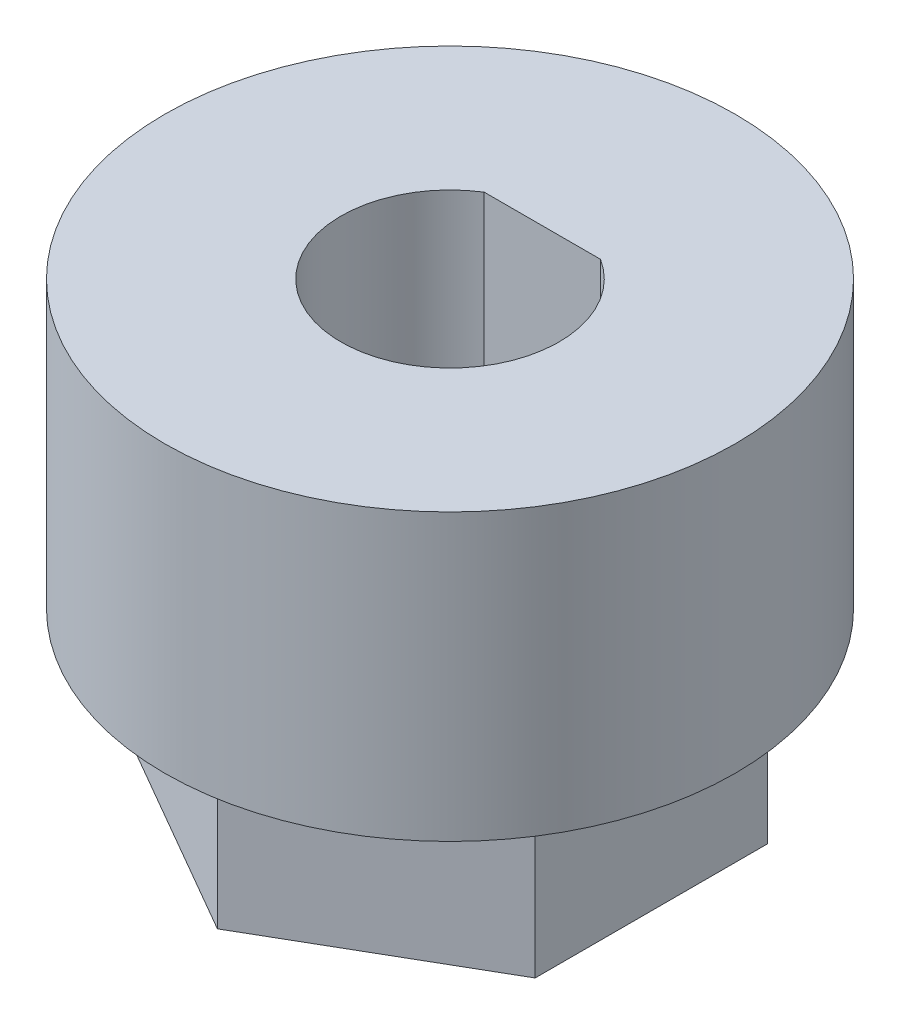
ISO-10303-21;
HEADER;
FILE_DESCRIPTION(('STEP AP214'),'2;1');
FILE_NAME('part.step','',(''),(''),'','','');
FILE_SCHEMA(('AUTOMOTIVE_DESIGN { 1 0 10303 214 1 1 1 1 }'));
ENDSEC;
DATA;
#1=APPLICATION_CONTEXT('core data for automotive mechanical design processes');
#2=APPLICATION_PROTOCOL_DEFINITION('international standard','automotive_design',2000,#1);
#3=PRODUCT_CONTEXT('',#1,'mechanical');
#4=PRODUCT('Part','Part','',(#3));
#5=PRODUCT_RELATED_PRODUCT_CATEGORY('part','',(#4));
#6=PRODUCT_DEFINITION_FORMATION('','',#4);
#7=PRODUCT_DEFINITION_CONTEXT('part definition',#1,'design');
#8=PRODUCT_DEFINITION('design','',#6,#7);
#9=PRODUCT_DEFINITION_SHAPE('','',#8);
#10=(LENGTH_UNIT() NAMED_UNIT(*) SI_UNIT(.MILLI.,.METRE.));
#11=(NAMED_UNIT(*) PLANE_ANGLE_UNIT() SI_UNIT($,.RADIAN.));
#12=(NAMED_UNIT(*) SI_UNIT($,.STERADIAN.) SOLID_ANGLE_UNIT());
#13=UNCERTAINTY_MEASURE_WITH_UNIT(LENGTH_MEASURE(1.E-05),#10,'distance_accuracy_value','');
#14=(GEOMETRIC_REPRESENTATION_CONTEXT(3) GLOBAL_UNCERTAINTY_ASSIGNED_CONTEXT((#13)) GLOBAL_UNIT_ASSIGNED_CONTEXT((#10,
#11,#12)) REPRESENTATION_CONTEXT('',''));
#15=CARTESIAN_POINT('',(0.,0.,0.));
#16=DIRECTION('',(0.,0.,1.));
#17=DIRECTION('',(1.,0.,0.));
#18=AXIS2_PLACEMENT_3D('',#15,#16,#17);
#19=CARTESIAN_POINT('',(0.,4.8,-6.9282032302755));
#20=DIRECTION('',(-0.499999999999998,0.,0.86602540378444));
#21=DIRECTION('',(0.86602540378444,0.,0.499999999999998));
#22=AXIS2_PLACEMENT_3D('',#19,#20,#21);
#23=PLANE('',#22);
#24=DIRECTION('',(-0.86602540378444,0.,-0.499999999999998));
#25=VECTOR('',#24,1.);
#26=CARTESIAN_POINT('',(0.,0.,-6.9282032302755));
#27=LINE('',#26,#25);
#28=CARTESIAN_POINT('',(5.99999999999997,0.,-3.46410161513778));
#29=VERTEX_POINT('',#28);
#30=CARTESIAN_POINT('',(0.,0.,-6.9282032302755));
#31=VERTEX_POINT('',#30);
#32=EDGE_CURVE('E136',#29,#31,#27,.T.);
#33=ORIENTED_EDGE('',*,*,#32,.T.);
#34=DIRECTION('',(0.,-1.,0.));
#35=VECTOR('',#34,1.);
#36=CARTESIAN_POINT('',(0.,4.8,-6.9282032302755));
#37=LINE('',#36,#35);
#38=CARTESIAN_POINT('',(0.,4.8,-6.9282032302755));
#39=VERTEX_POINT('',#38);
#40=EDGE_CURVE('E11',#39,#31,#37,.T.);
#41=ORIENTED_EDGE('',*,*,#40,.F.);
#42=DIRECTION('',(-0.86602540378444,0.,-0.499999999999998));
#43=VECTOR('',#42,1.);
#44=CARTESIAN_POINT('',(0.,4.8,-6.9282032302755));
#45=LINE('',#44,#43);
#46=CARTESIAN_POINT('',(5.99999999999997,4.8,-3.46410161513778));
#47=VERTEX_POINT('',#46);
#48=EDGE_CURVE('E140',#47,#39,#45,.T.);
#49=ORIENTED_EDGE('',*,*,#48,.F.);
#50=DIRECTION('',(0.,-1.,0.));
#51=VECTOR('',#50,1.);
#52=CARTESIAN_POINT('',(5.99999999999997,4.8,-3.46410161513778));
#53=LINE('',#52,#51);
#54=EDGE_CURVE('E165',#47,#29,#53,.T.);
#55=ORIENTED_EDGE('',*,*,#54,.T.);
#56=EDGE_LOOP('',(#33,#41,#49,#55));
#57=FACE_BOUND('',#56,.T.);
#58=ADVANCED_FACE('F43',(#57),#23,.F.);
#59=CARTESIAN_POINT('',(-6.00000000000003,4.8,-3.46410161513769));
#60=DIRECTION('',(0.500000000000004,0.,0.866025403784436));
#61=DIRECTION('',(0.866025403784436,0.,-0.500000000000004));
#62=AXIS2_PLACEMENT_3D('',#59,#60,#61);
#63=PLANE('',#62);
#64=DIRECTION('',(-0.866025403784436,0.,0.500000000000004));
#65=VECTOR('',#64,1.);
#66=CARTESIAN_POINT('',(-6.00000000000003,0.,-3.46410161513769));
#67=LINE('',#66,#65);
#68=CARTESIAN_POINT('',(-6.00000000000003,0.,-3.46410161513769));
#69=VERTEX_POINT('',#68);
#70=EDGE_CURVE('E169',#31,#69,#67,.T.);
#71=ORIENTED_EDGE('',*,*,#70,.T.);
#72=DIRECTION('',(0.,-1.,0.));
#73=VECTOR('',#72,1.);
#74=CARTESIAN_POINT('',(-6.00000000000003,4.8,-3.46410161513769));
#75=LINE('',#74,#73);
#76=CARTESIAN_POINT('',(-6.00000000000003,4.8,-3.46410161513769));
#77=VERTEX_POINT('',#76);
#78=EDGE_CURVE('E51',#77,#69,#75,.T.);
#79=ORIENTED_EDGE('',*,*,#78,.F.);
#80=DIRECTION('',(-0.866025403784436,0.,0.500000000000004));
#81=VECTOR('',#80,1.);
#82=CARTESIAN_POINT('',(-6.00000000000003,4.8,-3.46410161513769));
#83=LINE('',#82,#81);
#84=EDGE_CURVE('E144',#39,#77,#83,.T.);
#85=ORIENTED_EDGE('',*,*,#84,.F.);
#86=ORIENTED_EDGE('',*,*,#40,.T.);
#87=EDGE_LOOP('',(#71,#79,#85,#86));
#88=FACE_BOUND('',#87,.T.);
#89=ADVANCED_FACE('F218',(#88),#63,.F.);
#90=CARTESIAN_POINT('',(-5.99999999999997,4.8,3.46410161513778));
#91=DIRECTION('',(1.,0.,0.));
#92=DIRECTION('',(0.,0.,-1.));
#93=AXIS2_PLACEMENT_3D('',#90,#91,#92);
#94=PLANE('',#93);
#95=DIRECTION('',(0.,0.,1.));
#96=VECTOR('',#95,1.);
#97=CARTESIAN_POINT('',(-5.99999999999997,0.,3.46410161513778));
#98=LINE('',#97,#96);
#99=CARTESIAN_POINT('',(-5.99999999999997,0.,3.46410161513778));
#100=VERTEX_POINT('',#99);
#101=EDGE_CURVE('E172',#69,#100,#98,.T.);
#102=ORIENTED_EDGE('',*,*,#101,.T.);
#103=DIRECTION('',(0.,-1.,0.));
#104=VECTOR('',#103,1.);
#105=CARTESIAN_POINT('',(-5.99999999999997,4.8,3.46410161513778));
#106=LINE('',#105,#104);
#107=CARTESIAN_POINT('',(-5.99999999999997,4.8,3.46410161513778));
#108=VERTEX_POINT('',#107);
#109=EDGE_CURVE('E194',#108,#100,#106,.T.);
#110=ORIENTED_EDGE('',*,*,#109,.F.);
#111=DIRECTION('',(0.,0.,1.));
#112=VECTOR('',#111,1.);
#113=CARTESIAN_POINT('',(-5.99999999999997,4.8,3.46410161513778));
#114=LINE('',#113,#112);
#115=EDGE_CURVE('E149',#77,#108,#114,.T.);
#116=ORIENTED_EDGE('',*,*,#115,.F.);
#117=ORIENTED_EDGE('',*,*,#78,.T.);
#118=EDGE_LOOP('',(#102,#110,#116,#117));
#119=FACE_BOUND('',#118,.T.);
#120=ADVANCED_FACE('F202',(#119),#94,.F.);
#121=CARTESIAN_POINT('',(0.,4.8,6.9282032302755));
#122=DIRECTION('',(0.499999999999998,0.,-0.86602540378444));
#123=DIRECTION('',(-0.86602540378444,0.,-0.499999999999998));
#124=AXIS2_PLACEMENT_3D('',#121,#122,#123);
#125=PLANE('',#124);
#126=DIRECTION('',(0.86602540378444,0.,0.499999999999998));
#127=VECTOR('',#126,1.);
#128=CARTESIAN_POINT('',(0.,0.,6.9282032302755));
#129=LINE('',#128,#127);
#130=CARTESIAN_POINT('',(0.,0.,6.9282032302755));
#131=VERTEX_POINT('',#130);
#132=EDGE_CURVE('E175',#100,#131,#129,.T.);
#133=ORIENTED_EDGE('',*,*,#132,.T.);
#134=DIRECTION('',(0.,-1.,0.));
#135=VECTOR('',#134,1.);
#136=CARTESIAN_POINT('',(0.,4.8,6.9282032302755));
#137=LINE('',#136,#135);
#138=CARTESIAN_POINT('',(0.,4.8,6.9282032302755));
#139=VERTEX_POINT('',#138);
#140=EDGE_CURVE('E190',#139,#131,#137,.T.);
#141=ORIENTED_EDGE('',*,*,#140,.F.);
#142=DIRECTION('',(0.86602540378444,0.,0.499999999999998));
#143=VECTOR('',#142,1.);
#144=CARTESIAN_POINT('',(0.,4.8,6.9282032302755));
#145=LINE('',#144,#143);
#146=EDGE_CURVE('E153',#108,#139,#145,.T.);
#147=ORIENTED_EDGE('',*,*,#146,.F.);
#148=ORIENTED_EDGE('',*,*,#109,.T.);
#149=EDGE_LOOP('',(#133,#141,#147,#148));
#150=FACE_BOUND('',#149,.T.);
#151=ADVANCED_FACE('F209',(#150),#125,.F.);
#152=CARTESIAN_POINT('',(6.00000000000003,4.8,3.46410161513769));
#153=DIRECTION('',(-0.500000000000005,0.,-0.866025403784436));
#154=DIRECTION('',(-0.866025403784436,0.,0.500000000000005));
#155=AXIS2_PLACEMENT_3D('',#152,#153,#154);
#156=PLANE('',#155);
#157=DIRECTION('',(0.866025403784436,0.,-0.500000000000005));
#158=VECTOR('',#157,1.);
#159=CARTESIAN_POINT('',(6.00000000000003,0.,3.46410161513769));
#160=LINE('',#159,#158);
#161=CARTESIAN_POINT('',(6.00000000000003,0.,3.46410161513769));
#162=VERTEX_POINT('',#161);
#163=EDGE_CURVE('E178',#131,#162,#160,.T.);
#164=ORIENTED_EDGE('',*,*,#163,.T.);
#165=DIRECTION('',(0.,-1.,0.));
#166=VECTOR('',#165,1.);
#167=CARTESIAN_POINT('',(6.00000000000003,4.8,3.46410161513769));
#168=LINE('',#167,#166);
#169=CARTESIAN_POINT('',(6.00000000000003,4.8,3.46410161513769));
#170=VERTEX_POINT('',#169);
#171=EDGE_CURVE('E186',#170,#162,#168,.T.);
#172=ORIENTED_EDGE('',*,*,#171,.F.);
#173=DIRECTION('',(0.866025403784436,0.,-0.500000000000005));
#174=VECTOR('',#173,1.);
#175=CARTESIAN_POINT('',(6.00000000000003,4.8,3.46410161513769));
#176=LINE('',#175,#174);
#177=EDGE_CURVE('E157',#139,#170,#176,.T.);
#178=ORIENTED_EDGE('',*,*,#177,.F.);
#179=ORIENTED_EDGE('',*,*,#140,.T.);
#180=EDGE_LOOP('',(#164,#172,#178,#179));
#181=FACE_BOUND('',#180,.T.);
#182=ADVANCED_FACE('F213',(#181),#156,.F.);
#183=CARTESIAN_POINT('',(5.99999999999997,4.8,-3.46410161513778));
#184=DIRECTION('',(-1.,0.,0.));
#185=DIRECTION('',(0.,0.,1.));
#186=AXIS2_PLACEMENT_3D('',#183,#184,#185);
#187=PLANE('',#186);
#188=DIRECTION('',(0.,0.,-1.));
#189=VECTOR('',#188,1.);
#190=CARTESIAN_POINT('',(5.99999999999997,0.,-3.46410161513778));
#191=LINE('',#190,#189);
#192=EDGE_CURVE('E145',#162,#29,#191,.T.);
#193=ORIENTED_EDGE('',*,*,#192,.T.);
#194=ORIENTED_EDGE('',*,*,#54,.F.);
#195=DIRECTION('',(0.,0.,-1.));
#196=VECTOR('',#195,1.);
#197=CARTESIAN_POINT('',(5.99999999999997,4.8,-3.46410161513778));
#198=LINE('',#197,#196);
#199=EDGE_CURVE('E161',#170,#47,#198,.T.);
#200=ORIENTED_EDGE('',*,*,#199,.F.);
#201=ORIENTED_EDGE('',*,*,#171,.T.);
#202=EDGE_LOOP('',(#193,#194,#200,#201));
#203=FACE_BOUND('',#202,.T.);
#204=ADVANCED_FACE('F222',(#203),#187,.F.);
#205=CARTESIAN_POINT('',(0.,0.,0.));
#206=DIRECTION('',(0.,-1.,0.));
#207=DIRECTION('',(0.,0.,-1.));
#208=AXIS2_PLACEMENT_3D('',#205,#206,#207);
#209=PLANE('',#208);
#210=CARTESIAN_POINT('',(0.,0.,0.));
#211=DIRECTION('',(0.,1.,0.));
#212=DIRECTION('',(0.,0.,1.));
#213=AXIS2_PLACEMENT_3D('',#210,#211,#212);
#214=CIRCLE('',#213,3.25);
#215=CARTESIAN_POINT('',(-1.73205080756888,0.,-2.75));
#216=VERTEX_POINT('',#215);
#217=CARTESIAN_POINT('',(1.73205080756888,0.,-2.75));
#218=VERTEX_POINT('',#217);
#219=EDGE_CURVE('E58',#216,#218,#214,.T.);
#220=ORIENTED_EDGE('',*,*,#219,.T.);
#221=DIRECTION('',(-1.,0.,0.));
#222=VECTOR('',#221,1.);
#223=CARTESIAN_POINT('',(-1.73205080756888,0.,-2.75));
#224=LINE('',#223,#222);
#225=EDGE_CURVE('E112',#218,#216,#224,.T.);
#226=ORIENTED_EDGE('',*,*,#225,.T.);
#227=EDGE_LOOP('',(#220,#226));
#228=FACE_BOUND('',#227,.T.);
#229=ORIENTED_EDGE('',*,*,#32,.F.);
#230=ORIENTED_EDGE('',*,*,#192,.F.);
#231=ORIENTED_EDGE('',*,*,#163,.F.);
#232=ORIENTED_EDGE('',*,*,#132,.F.);
#233=ORIENTED_EDGE('',*,*,#101,.F.);
#234=ORIENTED_EDGE('',*,*,#70,.F.);
#235=EDGE_LOOP('',(#229,#230,#231,#232,#233,#234));
#236=FACE_BOUND('',#235,.T.);
#237=ADVANCED_FACE('F119',(#228,#236),#209,.T.);
#238=CARTESIAN_POINT('',(0.,4.8,0.));
#239=DIRECTION('',(0.,1.,0.));
#240=DIRECTION('',(0.,0.,1.));
#241=AXIS2_PLACEMENT_3D('',#238,#239,#240);
#242=PLANE('',#241);
#243=CARTESIAN_POINT('',(0.,4.8,0.));
#244=DIRECTION('',(0.,1.,0.));
#245=DIRECTION('',(0.,0.,1.));
#246=AXIS2_PLACEMENT_3D('',#243,#244,#245);
#247=CIRCLE('',#246,8.5);
#248=CARTESIAN_POINT('',(0.,4.8,8.5));
#249=VERTEX_POINT('',#248);
#250=EDGE_CURVE('E130',#249,#249,#247,.T.);
#251=ORIENTED_EDGE('',*,*,#250,.F.);
#252=EDGE_LOOP('',(#251));
#253=FACE_BOUND('',#252,.T.);
#254=ORIENTED_EDGE('',*,*,#199,.T.);
#255=ORIENTED_EDGE('',*,*,#48,.T.);
#256=ORIENTED_EDGE('',*,*,#84,.T.);
#257=ORIENTED_EDGE('',*,*,#115,.T.);
#258=ORIENTED_EDGE('',*,*,#146,.T.);
#259=ORIENTED_EDGE('',*,*,#177,.T.);
#260=EDGE_LOOP('',(#254,#255,#256,#257,#258,#259));
#261=FACE_BOUND('',#260,.T.);
#262=ADVANCED_FACE('F216',(#253,#261),#242,.F.);
#263=CARTESIAN_POINT('',(0.,13.3,0.));
#264=DIRECTION('',(0.,-1.,0.));
#265=DIRECTION('',(0.,0.,-1.));
#266=AXIS2_PLACEMENT_3D('',#263,#264,#265);
#267=CYLINDRICAL_SURFACE('',#266,8.5);
#268=CARTESIAN_POINT('',(0.,13.3,0.));
#269=DIRECTION('',(0.,1.,0.));
#270=DIRECTION('',(0.,0.,1.));
#271=AXIS2_PLACEMENT_3D('',#268,#269,#270);
#272=CIRCLE('',#271,8.5);
#273=CARTESIAN_POINT('',(0.,13.3,8.5));
#274=VERTEX_POINT('',#273);
#275=EDGE_CURVE('E132',#274,#274,#272,.T.);
#276=ORIENTED_EDGE('',*,*,#275,.F.);
#277=EDGE_LOOP('',(#276));
#278=FACE_BOUND('',#277,.T.);
#279=ORIENTED_EDGE('',*,*,#250,.T.);
#280=EDGE_LOOP('',(#279));
#281=FACE_BOUND('',#280,.T.);
#282=ADVANCED_FACE('F265',(#278,#281),#267,.T.);
#283=CARTESIAN_POINT('',(0.,13.3,0.));
#284=DIRECTION('',(0.,1.,0.));
#285=DIRECTION('',(0.,0.,1.));
#286=AXIS2_PLACEMENT_3D('',#283,#284,#285);
#287=PLANE('',#286);
#288=CARTESIAN_POINT('',(0.,13.3,0.));
#289=DIRECTION('',(0.,1.,0.));
#290=DIRECTION('',(0.,0.,1.));
#291=AXIS2_PLACEMENT_3D('',#288,#289,#290);
#292=CIRCLE('',#291,3.25);
#293=CARTESIAN_POINT('',(-1.73205080756888,13.3,-2.75));
#294=VERTEX_POINT('',#293);
#295=CARTESIAN_POINT('',(1.73205080756888,13.3,-2.75));
#296=VERTEX_POINT('',#295);
#297=EDGE_CURVE('E63',#294,#296,#292,.T.);
#298=ORIENTED_EDGE('',*,*,#297,.F.);
#299=DIRECTION('',(-1.,0.,0.));
#300=VECTOR('',#299,1.);
#301=CARTESIAN_POINT('',(-1.73205080756888,13.3,-2.75));
#302=LINE('',#301,#300);
#303=EDGE_CURVE('E122',#296,#294,#302,.T.);
#304=ORIENTED_EDGE('',*,*,#303,.F.);
#305=EDGE_LOOP('',(#298,#304));
#306=FACE_BOUND('',#305,.T.);
#307=ORIENTED_EDGE('',*,*,#275,.T.);
#308=EDGE_LOOP('',(#307));
#309=FACE_BOUND('',#308,.T.);
#310=ADVANCED_FACE('F276',(#306,#309),#287,.T.);
#311=CARTESIAN_POINT('',(0.,0.,0.));
#312=DIRECTION('',(0.,1.,0.));
#313=DIRECTION('',(0.,0.,1.));
#314=AXIS2_PLACEMENT_3D('',#311,#312,#313);
#315=CYLINDRICAL_SURFACE('',#314,3.25);
#316=ORIENTED_EDGE('',*,*,#297,.T.);
#317=DIRECTION('',(0.,1.,0.));
#318=VECTOR('',#317,1.);
#319=CARTESIAN_POINT('',(1.73205080756888,0.,-2.75));
#320=LINE('',#319,#318);
#321=EDGE_CURVE('E104',#218,#296,#320,.T.);
#322=ORIENTED_EDGE('',*,*,#321,.F.);
#323=ORIENTED_EDGE('',*,*,#219,.F.);
#324=DIRECTION('',(0.,1.,0.));
#325=VECTOR('',#324,1.);
#326=CARTESIAN_POINT('',(-1.73205080756888,0.,-2.75));
#327=LINE('',#326,#325);
#328=EDGE_CURVE('E111',#216,#294,#327,.T.);
#329=ORIENTED_EDGE('',*,*,#328,.T.);
#330=EDGE_LOOP('',(#316,#322,#323,#329));
#331=FACE_BOUND('',#330,.T.);
#332=ADVANCED_FACE('F106',(#331),#315,.F.);
#333=CARTESIAN_POINT('',(-1.73205080756888,0.,-2.75));
#334=DIRECTION('',(0.,0.,-1.));
#335=DIRECTION('',(-1.,0.,0.));
#336=AXIS2_PLACEMENT_3D('',#333,#334,#335);
#337=PLANE('',#336);
#338=ORIENTED_EDGE('',*,*,#303,.T.);
#339=ORIENTED_EDGE('',*,*,#328,.F.);
#340=ORIENTED_EDGE('',*,*,#225,.F.);
#341=ORIENTED_EDGE('',*,*,#321,.T.);
#342=EDGE_LOOP('',(#338,#339,#340,#341));
#343=FACE_BOUND('',#342,.T.);
#344=ADVANCED_FACE('F115',(#343),#337,.F.);
#345=CLOSED_SHELL('',(#58,#89,#120,#151,#182,#204,#237,#262,#282,#310,#332,#344));
#346=MANIFOLD_SOLID_BREP('B2',#345);
#347=ADVANCED_BREP_SHAPE_REPRESENTATION('',(#18,#346),#14);
#348=SHAPE_DEFINITION_REPRESENTATION(#9,#347);
ENDSEC;
END-ISO-10303-21;
